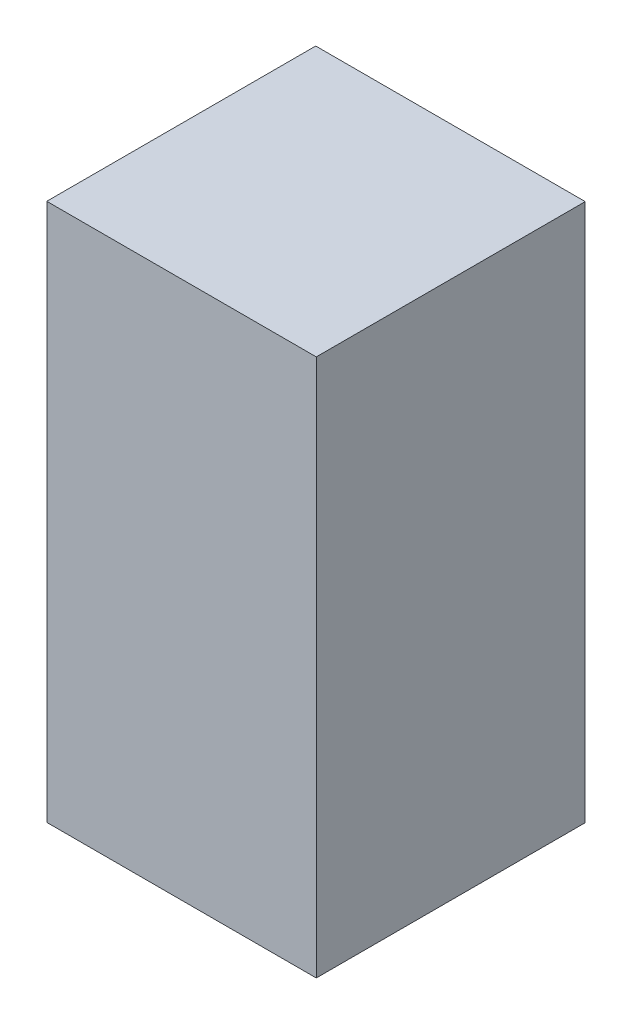
ISO-10303-21;
HEADER;
FILE_DESCRIPTION(('STEP AP214'),'2;1');
FILE_NAME('part.step','',(''),(''),'','','');
FILE_SCHEMA(('AUTOMOTIVE_DESIGN { 1 0 10303 214 1 1 1 1 }'));
ENDSEC;
DATA;
#1=APPLICATION_CONTEXT('core data for automotive mechanical design processes');
#2=APPLICATION_PROTOCOL_DEFINITION('international standard','automotive_design',2000,#1);
#3=PRODUCT_CONTEXT('',#1,'mechanical');
#4=PRODUCT('Part','Part','',(#3));
#5=PRODUCT_RELATED_PRODUCT_CATEGORY('part','',(#4));
#6=PRODUCT_DEFINITION_FORMATION('','',#4);
#7=PRODUCT_DEFINITION_CONTEXT('part definition',#1,'design');
#8=PRODUCT_DEFINITION('design','',#6,#7);
#9=PRODUCT_DEFINITION_SHAPE('','',#8);
#10=(LENGTH_UNIT() NAMED_UNIT(*) SI_UNIT(.MILLI.,.METRE.));
#11=(NAMED_UNIT(*) PLANE_ANGLE_UNIT() SI_UNIT($,.RADIAN.));
#12=(NAMED_UNIT(*) SI_UNIT($,.STERADIAN.) SOLID_ANGLE_UNIT());
#13=UNCERTAINTY_MEASURE_WITH_UNIT(LENGTH_MEASURE(1.E-05),#10,'distance_accuracy_value','');
#14=(GEOMETRIC_REPRESENTATION_CONTEXT(3) GLOBAL_UNCERTAINTY_ASSIGNED_CONTEXT((#13)) GLOBAL_UNIT_ASSIGNED_CONTEXT((#10,
#11,#12)) REPRESENTATION_CONTEXT('',''));
#15=CARTESIAN_POINT('',(0.,0.,0.));
#16=DIRECTION('',(0.,0.,1.));
#17=DIRECTION('',(1.,0.,0.));
#18=AXIS2_PLACEMENT_3D('',#15,#16,#17);
#19=CARTESIAN_POINT('',(-0.400812,0.799973,0.8));
#20=DIRECTION('',(0.,0.,1.));
#21=DIRECTION('',(1.,0.,0.));
#22=AXIS2_PLACEMENT_3D('',#19,#20,#21);
#23=PLANE('',#22);
#24=DIRECTION('',(1.,0.,0.));
#25=VECTOR('',#24,1.);
#26=CARTESIAN_POINT('',(0.400812,-0.799973,0.8));
#27=LINE('',#26,#25);
#28=CARTESIAN_POINT('',(0.400812,-0.799973,0.8));
#29=VERTEX_POINT('',#28);
#30=CARTESIAN_POINT('',(-0.400812,-0.799973,0.8));
#31=VERTEX_POINT('',#30);
#32=EDGE_CURVE('E58',#29,#31,#27,.F.);
#33=ORIENTED_EDGE('',*,*,#32,.F.);
#34=DIRECTION('',(0.,1.,0.));
#35=VECTOR('',#34,1.);
#36=CARTESIAN_POINT('',(0.400812,0.799973,0.8));
#37=LINE('',#36,#35);
#38=CARTESIAN_POINT('',(0.400812,0.799973,0.8));
#39=VERTEX_POINT('',#38);
#40=EDGE_CURVE('E53',#39,#29,#37,.F.);
#41=ORIENTED_EDGE('',*,*,#40,.F.);
#42=DIRECTION('',(1.,0.,0.));
#43=VECTOR('',#42,1.);
#44=CARTESIAN_POINT('',(-0.400812,0.799973,0.8));
#45=LINE('',#44,#43);
#46=CARTESIAN_POINT('',(-0.400812,0.799973,0.8));
#47=VERTEX_POINT('',#46);
#48=EDGE_CURVE('E68',#47,#39,#45,.T.);
#49=ORIENTED_EDGE('',*,*,#48,.F.);
#50=DIRECTION('',(0.,1.,0.));
#51=VECTOR('',#50,1.);
#52=CARTESIAN_POINT('',(-0.400812,-0.799973,0.8));
#53=LINE('',#52,#51);
#54=EDGE_CURVE('E20',#31,#47,#53,.T.);
#55=ORIENTED_EDGE('',*,*,#54,.F.);
#56=EDGE_LOOP('',(#33,#41,#49,#55));
#57=FACE_BOUND('',#56,.T.);
#58=ADVANCED_FACE('F17',(#57),#23,.T.);
#59=CARTESIAN_POINT('',(-0.400812,-0.799973,0.));
#60=DIRECTION('',(-1.,0.,0.));
#61=DIRECTION('',(0.,0.,1.));
#62=AXIS2_PLACEMENT_3D('',#59,#60,#61);
#63=PLANE('',#62);
#64=DIRECTION('',(0.,0.,1.));
#65=VECTOR('',#64,1.);
#66=CARTESIAN_POINT('',(-0.400812,0.799973,0.));
#67=LINE('',#66,#65);
#68=CARTESIAN_POINT('',(-0.400812,0.799973,0.));
#69=VERTEX_POINT('',#68);
#70=EDGE_CURVE('E79',#69,#47,#67,.T.);
#71=ORIENTED_EDGE('',*,*,#70,.F.);
#72=DIRECTION('',(0.,1.,0.));
#73=VECTOR('',#72,1.);
#74=CARTESIAN_POINT('',(-0.400812,0.799973,0.));
#75=LINE('',#74,#73);
#76=CARTESIAN_POINT('',(-0.400812,-0.799973,0.));
#77=VERTEX_POINT('',#76);
#78=EDGE_CURVE('E74',#69,#77,#75,.F.);
#79=ORIENTED_EDGE('',*,*,#78,.T.);
#80=DIRECTION('',(0.,0.,-1.));
#81=VECTOR('',#80,1.);
#82=CARTESIAN_POINT('',(-0.400812,-0.799973,0.));
#83=LINE('',#82,#81);
#84=EDGE_CURVE('E63',#31,#77,#83,.T.);
#85=ORIENTED_EDGE('',*,*,#84,.F.);
#86=ORIENTED_EDGE('',*,*,#54,.T.);
#87=EDGE_LOOP('',(#71,#79,#85,#86));
#88=FACE_BOUND('',#87,.T.);
#89=ADVANCED_FACE('F73',(#88),#63,.T.);
#90=CARTESIAN_POINT('',(0.400812,-0.799973,0.));
#91=DIRECTION('',(0.,-1.,0.));
#92=DIRECTION('',(0.,0.,-1.));
#93=AXIS2_PLACEMENT_3D('',#90,#91,#92);
#94=PLANE('',#93);
#95=ORIENTED_EDGE('',*,*,#84,.T.);
#96=DIRECTION('',(1.,0.,0.));
#97=VECTOR('',#96,1.);
#98=CARTESIAN_POINT('',(-0.400812,-0.799973,0.));
#99=LINE('',#98,#97);
#100=CARTESIAN_POINT('',(0.400812,-0.799973,0.));
#101=VERTEX_POINT('',#100);
#102=EDGE_CURVE('E84',#77,#101,#99,.T.);
#103=ORIENTED_EDGE('',*,*,#102,.T.);
#104=DIRECTION('',(0.,0.,-1.));
#105=VECTOR('',#104,1.);
#106=CARTESIAN_POINT('',(0.400812,-0.799973,0.));
#107=LINE('',#106,#105);
#108=EDGE_CURVE('E65',#29,#101,#107,.T.);
#109=ORIENTED_EDGE('',*,*,#108,.F.);
#110=ORIENTED_EDGE('',*,*,#32,.T.);
#111=EDGE_LOOP('',(#95,#103,#109,#110));
#112=FACE_BOUND('',#111,.T.);
#113=ADVANCED_FACE('F60',(#112),#94,.T.);
#114=CARTESIAN_POINT('',(0.400812,0.799973,0.));
#115=DIRECTION('',(1.,0.,0.));
#116=DIRECTION('',(0.,0.,-1.));
#117=AXIS2_PLACEMENT_3D('',#114,#115,#116);
#118=PLANE('',#117);
#119=ORIENTED_EDGE('',*,*,#108,.T.);
#120=DIRECTION('',(0.,1.,0.));
#121=VECTOR('',#120,1.);
#122=CARTESIAN_POINT('',(0.400812,0.799973,0.));
#123=LINE('',#122,#121);
#124=CARTESIAN_POINT('',(0.400812,0.799973,0.));
#125=VERTEX_POINT('',#124);
#126=EDGE_CURVE('E26',#101,#125,#123,.T.);
#127=ORIENTED_EDGE('',*,*,#126,.T.);
#128=DIRECTION('',(0.,0.,1.));
#129=VECTOR('',#128,1.);
#130=CARTESIAN_POINT('',(0.400812,0.799973,0.));
#131=LINE('',#130,#129);
#132=EDGE_CURVE('E34',#39,#125,#131,.F.);
#133=ORIENTED_EDGE('',*,*,#132,.F.);
#134=ORIENTED_EDGE('',*,*,#40,.T.);
#135=EDGE_LOOP('',(#119,#127,#133,#134));
#136=FACE_BOUND('',#135,.T.);
#137=ADVANCED_FACE('F88',(#136),#118,.T.);
#138=CARTESIAN_POINT('',(-0.400812,0.799973,0.));
#139=DIRECTION('',(0.,1.,0.));
#140=DIRECTION('',(0.,0.,1.));
#141=AXIS2_PLACEMENT_3D('',#138,#139,#140);
#142=PLANE('',#141);
#143=ORIENTED_EDGE('',*,*,#132,.T.);
#144=DIRECTION('',(1.,0.,0.));
#145=VECTOR('',#144,1.);
#146=CARTESIAN_POINT('',(-0.400812,0.799973,0.));
#147=LINE('',#146,#145);
#148=EDGE_CURVE('E11',#125,#69,#147,.F.);
#149=ORIENTED_EDGE('',*,*,#148,.T.);
#150=ORIENTED_EDGE('',*,*,#70,.T.);
#151=ORIENTED_EDGE('',*,*,#48,.T.);
#152=EDGE_LOOP('',(#143,#149,#150,#151));
#153=FACE_BOUND('',#152,.T.);
#154=ADVANCED_FACE('F91',(#153),#142,.T.);
#155=CARTESIAN_POINT('',(-0.400812,0.799973,0.));
#156=DIRECTION('',(0.,0.,1.));
#157=DIRECTION('',(1.,0.,0.));
#158=AXIS2_PLACEMENT_3D('',#155,#156,#157);
#159=PLANE('',#158);
#160=ORIENTED_EDGE('',*,*,#126,.F.);
#161=ORIENTED_EDGE('',*,*,#102,.F.);
#162=ORIENTED_EDGE('',*,*,#78,.F.);
#163=ORIENTED_EDGE('',*,*,#148,.F.);
#164=EDGE_LOOP('',(#160,#161,#162,#163));
#165=FACE_BOUND('',#164,.T.);
#166=ADVANCED_FACE('F90',(#165),#159,.F.);
#167=CLOSED_SHELL('',(#58,#89,#113,#137,#154,#166));
#168=MANIFOLD_SOLID_BREP('B1',#167);
#169=ADVANCED_BREP_SHAPE_REPRESENTATION('',(#18,#168),#14);
#170=SHAPE_DEFINITION_REPRESENTATION(#9,#169);
ENDSEC;
END-ISO-10303-21;
